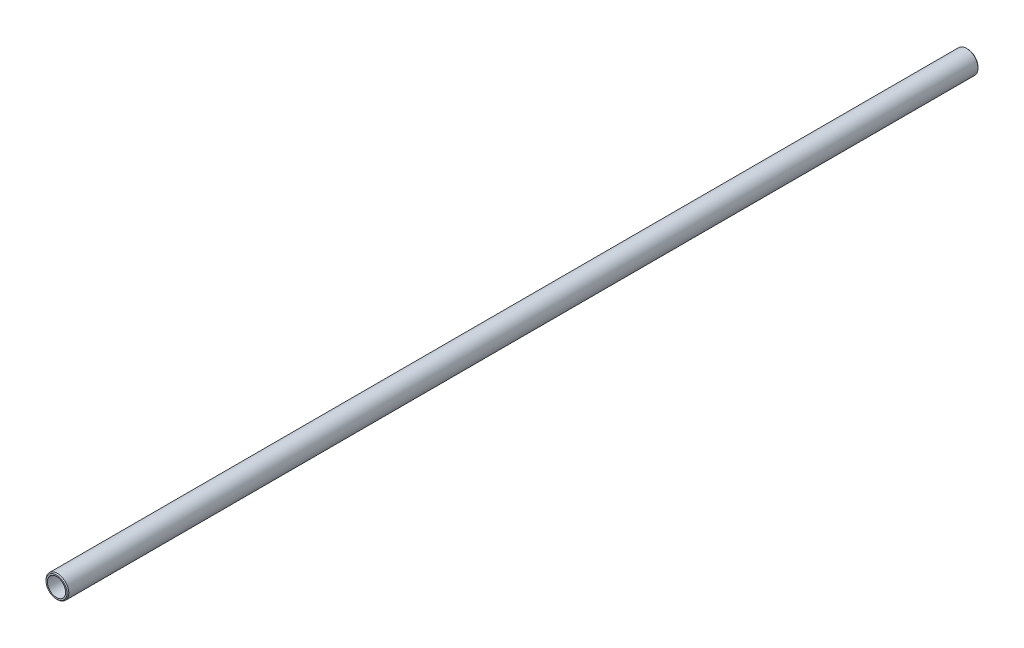
ISO-10303-21;
HEADER;
FILE_DESCRIPTION(('STEP AP214'),'2;1');
FILE_NAME('part.step','',(''),(''),'','','');
FILE_SCHEMA(('AUTOMOTIVE_DESIGN { 1 0 10303 214 1 1 1 1 }'));
ENDSEC;
DATA;
#1=APPLICATION_CONTEXT('core data for automotive mechanical design processes');
#2=APPLICATION_PROTOCOL_DEFINITION('international standard','automotive_design',2000,#1);
#3=PRODUCT_CONTEXT('',#1,'mechanical');
#4=PRODUCT('Part','Part','',(#3));
#5=PRODUCT_RELATED_PRODUCT_CATEGORY('part','',(#4));
#6=PRODUCT_DEFINITION_FORMATION('','',#4);
#7=PRODUCT_DEFINITION_CONTEXT('part definition',#1,'design');
#8=PRODUCT_DEFINITION('design','',#6,#7);
#9=PRODUCT_DEFINITION_SHAPE('','',#8);
#10=(LENGTH_UNIT() NAMED_UNIT(*) SI_UNIT(.MILLI.,.METRE.));
#11=(NAMED_UNIT(*) PLANE_ANGLE_UNIT() SI_UNIT($,.RADIAN.));
#12=(NAMED_UNIT(*) SI_UNIT($,.STERADIAN.) SOLID_ANGLE_UNIT());
#13=UNCERTAINTY_MEASURE_WITH_UNIT(LENGTH_MEASURE(1.E-05),#10,'distance_accuracy_value','');
#14=(GEOMETRIC_REPRESENTATION_CONTEXT(3) GLOBAL_UNCERTAINTY_ASSIGNED_CONTEXT((#13)) GLOBAL_UNIT_ASSIGNED_CONTEXT((#10,
#11,#12)) REPRESENTATION_CONTEXT('',''));
#15=CARTESIAN_POINT('',(0.,0.,0.));
#16=DIRECTION('',(0.,0.,1.));
#17=DIRECTION('',(1.,0.,0.));
#18=AXIS2_PLACEMENT_3D('',#15,#16,#17);
#19=CARTESIAN_POINT('',(0.,0.,400.));
#20=DIRECTION('',(0.,0.,1.));
#21=DIRECTION('',(1.,0.,0.));
#22=AXIS2_PLACEMENT_3D('',#19,#20,#21);
#23=PLANE('',#22);
#24=CARTESIAN_POINT('',(0.,0.,400.));
#25=DIRECTION('',(0.,0.,1.));
#26=DIRECTION('',(1.,0.,0.));
#27=AXIS2_PLACEMENT_3D('',#24,#25,#26);
#28=CIRCLE('',#27,4.59999999999999);
#29=CARTESIAN_POINT('',(-4.60000000000002,0.,400.));
#30=VERTEX_POINT('',#29);
#31=EDGE_CURVE('E10',#30,#30,#28,.T.);
#32=ORIENTED_EDGE('',*,*,#31,.T.);
#33=EDGE_LOOP('',(#32));
#34=FACE_BOUND('',#33,.T.);
#35=CARTESIAN_POINT('',(0.,0.,400.));
#36=DIRECTION('',(0.,0.,1.));
#37=DIRECTION('',(1.,0.,0.));
#38=AXIS2_PLACEMENT_3D('',#35,#36,#37);
#39=CIRCLE('',#38,4.);
#40=CARTESIAN_POINT('',(4.,0.,400.));
#41=VERTEX_POINT('',#40);
#42=EDGE_CURVE('E66',#41,#41,#39,.T.);
#43=ORIENTED_EDGE('',*,*,#42,.F.);
#44=EDGE_LOOP('',(#43));
#45=FACE_BOUND('',#44,.T.);
#46=ADVANCED_FACE('F45',(#34,#45),#23,.T.);
#47=CARTESIAN_POINT('',(0.,0.,0.));
#48=DIRECTION('',(0.,0.,1.));
#49=DIRECTION('',(1.,0.,0.));
#50=AXIS2_PLACEMENT_3D('',#47,#48,#49);
#51=PLANE('',#50);
#52=CARTESIAN_POINT('',(0.,0.,0.));
#53=DIRECTION('',(0.,0.,1.));
#54=DIRECTION('',(1.,0.,0.));
#55=AXIS2_PLACEMENT_3D('',#52,#53,#54);
#56=CIRCLE('',#55,4.59999999999988);
#57=CARTESIAN_POINT('',(4.59999999999988,0.,0.));
#58=VERTEX_POINT('',#57);
#59=EDGE_CURVE('E53',#58,#58,#56,.F.);
#60=ORIENTED_EDGE('',*,*,#59,.T.);
#61=EDGE_LOOP('',(#60));
#62=FACE_BOUND('',#61,.T.);
#63=CARTESIAN_POINT('',(0.,0.,0.));
#64=DIRECTION('',(0.,0.,1.));
#65=DIRECTION('',(1.,0.,0.));
#66=AXIS2_PLACEMENT_3D('',#63,#64,#65);
#67=CIRCLE('',#66,4.);
#68=CARTESIAN_POINT('',(4.,0.,0.));
#69=VERTEX_POINT('',#68);
#70=EDGE_CURVE('E67',#69,#69,#67,.T.);
#71=ORIENTED_EDGE('',*,*,#70,.T.);
#72=EDGE_LOOP('',(#71));
#73=FACE_BOUND('',#72,.T.);
#74=ADVANCED_FACE('F77',(#62,#73),#51,.F.);
#75=CARTESIAN_POINT('',(0.,0.,400.));
#76=DIRECTION('',(0.,0.,-1.));
#77=DIRECTION('',(-1.,0.,0.));
#78=AXIS2_PLACEMENT_3D('',#75,#76,#77);
#79=CYLINDRICAL_SURFACE('',#78,5.);
#80=CARTESIAN_POINT('',(0.,0.,0.400000000000067));
#81=DIRECTION('',(0.,0.,1.));
#82=DIRECTION('',(1.,0.,0.));
#83=AXIS2_PLACEMENT_3D('',#80,#81,#82);
#84=CIRCLE('',#83,5.);
#85=CARTESIAN_POINT('',(5.,0.,0.400000000000067));
#86=VERTEX_POINT('',#85);
#87=EDGE_CURVE('E57',#86,#86,#84,.T.);
#88=ORIENTED_EDGE('',*,*,#87,.T.);
#89=EDGE_LOOP('',(#88));
#90=FACE_BOUND('',#89,.T.);
#91=CARTESIAN_POINT('',(0.,0.,399.6));
#92=DIRECTION('',(0.,0.,1.));
#93=DIRECTION('',(1.,0.,0.));
#94=AXIS2_PLACEMENT_3D('',#91,#92,#93);
#95=CIRCLE('',#94,5.);
#96=CARTESIAN_POINT('',(-5.00000000000003,0.,399.6));
#97=VERTEX_POINT('',#96);
#98=EDGE_CURVE('E61',#97,#97,#95,.F.);
#99=ORIENTED_EDGE('',*,*,#98,.T.);
#100=EDGE_LOOP('',(#99));
#101=FACE_BOUND('',#100,.T.);
#102=ADVANCED_FACE('F83',(#90,#101),#79,.T.);
#103=CARTESIAN_POINT('',(0.,0.,400.));
#104=DIRECTION('',(0.,0.,-1.));
#105=DIRECTION('',(-1.,0.,0.));
#106=AXIS2_PLACEMENT_3D('',#103,#104,#105);
#107=CYLINDRICAL_SURFACE('',#106,4.);
#108=ORIENTED_EDGE('',*,*,#42,.T.);
#109=EDGE_LOOP('',(#108));
#110=FACE_BOUND('',#109,.T.);
#111=ORIENTED_EDGE('',*,*,#70,.F.);
#112=EDGE_LOOP('',(#111));
#113=FACE_BOUND('',#112,.T.);
#114=ADVANCED_FACE('F73',(#110,#113),#107,.F.);
#115=CARTESIAN_POINT('',(0.,0.,0.400000000000067));
#116=DIRECTION('',(0.,0.,1.));
#117=DIRECTION('',(1.,0.,0.));
#118=AXIS2_PLACEMENT_3D('',#115,#116,#117);
#119=CONICAL_SURFACE('',#118,5.,0.785398163397512);
#120=ORIENTED_EDGE('',*,*,#59,.F.);
#121=EDGE_LOOP('',(#120));
#122=FACE_BOUND('',#121,.T.);
#123=ORIENTED_EDGE('',*,*,#87,.F.);
#124=EDGE_LOOP('',(#123));
#125=FACE_BOUND('',#124,.T.);
#126=ADVANCED_FACE('F90',(#122,#125),#119,.T.);
#127=CARTESIAN_POINT('',(0.,0.,400.));
#128=DIRECTION('',(0.,0.,-1.));
#129=DIRECTION('',(-1.,0.,0.));
#130=AXIS2_PLACEMENT_3D('',#127,#128,#129);
#131=CONICAL_SURFACE('',#130,4.59999999999999,0.785398163397512);
#132=CARTESIAN_POINT('',(-5.00000000000003,0.,399.6));
#133=CARTESIAN_POINT('',(-4.99583333333338,0.,399.604166666667));
#134=CARTESIAN_POINT('',(-4.9916666666667,0.,399.608333333333));
#135=CARTESIAN_POINT('',(-4.98333333333336,0.,399.616666666667));
#136=CARTESIAN_POINT('',(-4.97916666666669,0.,399.620833333333));
#137=CARTESIAN_POINT('',(-4.97083333333336,0.,399.629166666667));
#138=CARTESIAN_POINT('',(-4.9666666666667,0.,399.633333333333));
#139=CARTESIAN_POINT('',(-4.95833333333337,0.,399.641666666667));
#140=CARTESIAN_POINT('',(-4.95416666666669,0.,399.645833333333));
#141=CARTESIAN_POINT('',(-4.94583333333336,0.,399.654166666667));
#142=CARTESIAN_POINT('',(-4.9416666666667,0.,399.658333333333));
#143=CARTESIAN_POINT('',(-4.93333333333336,0.,399.666666666667));
#144=CARTESIAN_POINT('',(-4.92916666666669,0.,399.670833333333));
#145=CARTESIAN_POINT('',(-4.92083333333336,0.,399.679166666667));
#146=CARTESIAN_POINT('',(-4.9166666666667,0.,399.683333333333));
#147=CARTESIAN_POINT('',(-4.90833333333336,0.,399.691666666667));
#148=CARTESIAN_POINT('',(-4.90416666666669,0.,399.695833333333));
#149=CARTESIAN_POINT('',(-4.89583333333335,0.,399.704166666667));
#150=CARTESIAN_POINT('',(-4.8916666666667,0.,399.708333333333));
#151=CARTESIAN_POINT('',(-4.88333333333336,0.,399.716666666667));
#152=CARTESIAN_POINT('',(-4.87916666666669,0.,399.720833333333));
#153=CARTESIAN_POINT('',(-4.87083333333335,0.,399.729166666667));
#154=CARTESIAN_POINT('',(-4.86666666666669,0.,399.733333333333));
#155=CARTESIAN_POINT('',(-4.85833333333336,0.,399.741666666667));
#156=CARTESIAN_POINT('',(-4.8541666666667,0.,399.745833333333));
#157=CARTESIAN_POINT('',(-4.84583333333336,0.,399.754166666667));
#158=CARTESIAN_POINT('',(-4.84166666666669,0.,399.758333333333));
#159=CARTESIAN_POINT('',(-4.83333333333336,0.,399.766666666667));
#160=CARTESIAN_POINT('',(-4.82916666666668,0.,399.770833333333));
#161=CARTESIAN_POINT('',(-4.82083333333336,0.,399.779166666667));
#162=CARTESIAN_POINT('',(-4.8166666666667,0.,399.783333333333));
#163=CARTESIAN_POINT('',(-4.80833333333336,0.,399.791666666667));
#164=CARTESIAN_POINT('',(-4.80416666666669,0.,399.795833333333));
#165=CARTESIAN_POINT('',(-4.79583333333335,0.,399.804166666667));
#166=CARTESIAN_POINT('',(-4.7916666666667,0.,399.808333333333));
#167=CARTESIAN_POINT('',(-4.78333333333336,0.,399.816666666667));
#168=CARTESIAN_POINT('',(-4.77916666666669,0.,399.820833333333));
#169=CARTESIAN_POINT('',(-4.77083333333335,0.,399.829166666667));
#170=CARTESIAN_POINT('',(-4.7666666666667,0.,399.833333333333));
#171=CARTESIAN_POINT('',(-4.75833333333336,0.,399.841666666667));
#172=CARTESIAN_POINT('',(-4.75416666666669,0.,399.845833333333));
#173=CARTESIAN_POINT('',(-4.74583333333335,0.,399.854166666667));
#174=CARTESIAN_POINT('',(-4.74166666666669,0.,399.858333333333));
#175=CARTESIAN_POINT('',(-4.73333333333336,0.,399.866666666667));
#176=CARTESIAN_POINT('',(-4.72916666666669,0.,399.870833333333));
#177=CARTESIAN_POINT('',(-4.72083333333335,0.,399.879166666667));
#178=CARTESIAN_POINT('',(-4.71666666666669,0.,399.883333333333));
#179=CARTESIAN_POINT('',(-4.70833333333336,0.,399.891666666667));
#180=CARTESIAN_POINT('',(-4.7041666666667,0.,399.895833333333));
#181=CARTESIAN_POINT('',(-4.69583333333336,0.,399.904166666667));
#182=CARTESIAN_POINT('',(-4.69166666666668,0.,399.908333333333));
#183=CARTESIAN_POINT('',(-4.68333333333335,0.,399.916666666667));
#184=CARTESIAN_POINT('',(-4.67916666666669,0.,399.920833333333));
#185=CARTESIAN_POINT('',(-4.67083333333336,0.,399.929166666667));
#186=CARTESIAN_POINT('',(-4.66666666666668,0.,399.933333333333));
#187=CARTESIAN_POINT('',(-4.65833333333335,0.,399.941666666667));
#188=CARTESIAN_POINT('',(-4.65416666666669,0.,399.945833333333));
#189=CARTESIAN_POINT('',(-4.64583333333336,0.,399.954166666667));
#190=CARTESIAN_POINT('',(-4.64166666666668,0.,399.958333333333));
#191=CARTESIAN_POINT('',(-4.63333333333335,0.,399.966666666667));
#192=CARTESIAN_POINT('',(-4.62916666666669,0.,399.970833333333));
#193=CARTESIAN_POINT('',(-4.62083333333336,0.,399.979166666667));
#194=CARTESIAN_POINT('',(-4.61666666666669,0.,399.983333333333));
#195=CARTESIAN_POINT('',(-4.60833333333334,0.,399.991666666667));
#196=CARTESIAN_POINT('',(-4.60416666666667,0.,399.995833333333));
#197=CARTESIAN_POINT('',(-4.60000000000002,0.,400.));
#198=B_SPLINE_CURVE_WITH_KNOTS('',3,(#132,#133,#134,#135,#136,#137,#138,#139,#140,#141,#142,
#143,#144,#145,#146,#147,#148,#149,#150,#151,#152,#153,#154,#155,#156,#157,#158,#159,#160,#161,
#162,#163,#164,#165,#166,#167,#168,#169,#170,#171,#172,#173,#174,#175,#176,#177,#178,#179,#180,
#181,#182,#183,#184,#185,#186,#187,#188,#189,#190,#191,#192,#193,#194,#195,#196,#197),
.UNSPECIFIED.,.F.,.F.,(4,2,2,2,2,2,2,2,2,2,2,2,2,2,2,2,2,2,2,2,2,2,2,2,2,2,2,2,2,2,2,2,4),(0.,
0.0176776695296826,0.0353553390593259,0.0530330085890079,0.0707106781186513,0.0883883476483339,
0.106066017177977,0.12374368670766,0.141421356237303,0.159099025766986,0.176776695296628,
0.194454364826311,0.212132034355994,0.229809703885637,0.24748737341528,0.265165042944963,
0.282842712474606,0.300520382004288,0.318198051533932,0.335875721063614,0.353553390593257,
0.37123106012294,0.388908729652583,0.406586399182265,0.424264068711948,0.441941738241591,
0.459619407771274,0.477297077300917,0.4949747468306,0.512652416360243,0.530330085889925,
0.548007755419568,0.565685424949251),.UNSPECIFIED.);
#199=EDGE_CURVE('BSEAM48',#97,#30,#198,.T.);
#200=ORIENTED_EDGE('',*,*,#98,.F.);
#201=ORIENTED_EDGE('',*,*,#31,.F.);
#202=ORIENTED_EDGE('',*,*,#199,.T.);
#203=ORIENTED_EDGE('',*,*,#199,.F.);
#204=EDGE_LOOP('',(#200,#202,#201,#203));
#205=FACE_BOUND('',#204,.T.);
#206=ADVANCED_FACE('F48',(#205),#131,.T.);
#207=CLOSED_SHELL('',(#46,#74,#102,#114,#126,#206));
#208=MANIFOLD_SOLID_BREP('B2',#207);
#209=ADVANCED_BREP_SHAPE_REPRESENTATION('',(#18,#208),#14);
#210=SHAPE_DEFINITION_REPRESENTATION(#9,#209);
ENDSEC;
END-ISO-10303-21;
